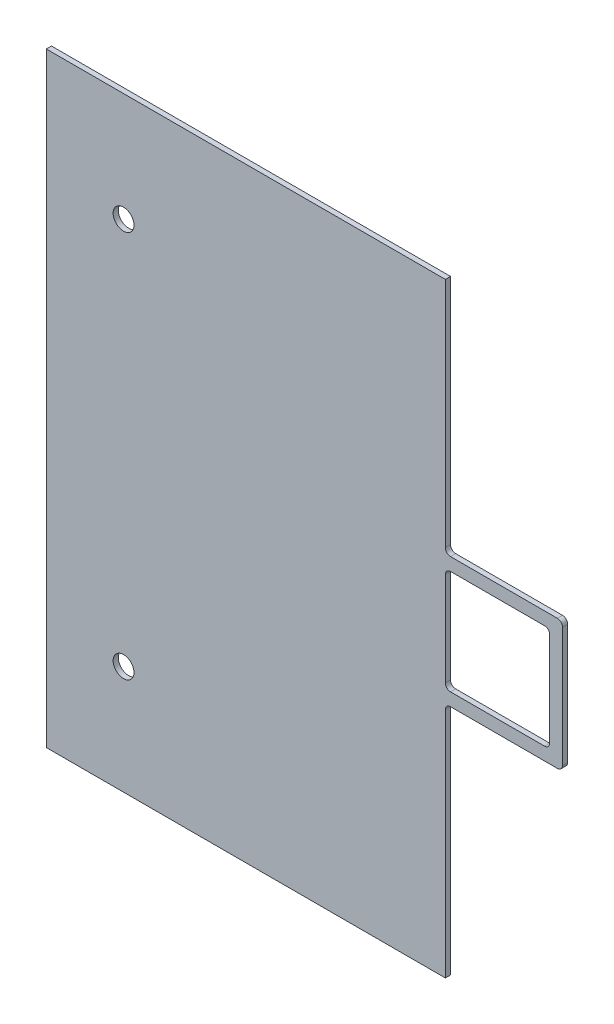
ISO-10303-21;
HEADER;
FILE_DESCRIPTION(('STEP AP214'),'2;1');
FILE_NAME('part.step','',(''),(''),'','','');
FILE_SCHEMA(('AUTOMOTIVE_DESIGN { 1 0 10303 214 1 1 1 1 }'));
ENDSEC;
DATA;
#1=APPLICATION_CONTEXT('core data for automotive mechanical design processes');
#2=APPLICATION_PROTOCOL_DEFINITION('international standard','automotive_design',2000,#1);
#3=PRODUCT_CONTEXT('',#1,'mechanical');
#4=PRODUCT('Part','Part','',(#3));
#5=PRODUCT_RELATED_PRODUCT_CATEGORY('part','',(#4));
#6=PRODUCT_DEFINITION_FORMATION('','',#4);
#7=PRODUCT_DEFINITION_CONTEXT('part definition',#1,'design');
#8=PRODUCT_DEFINITION('design','',#6,#7);
#9=PRODUCT_DEFINITION_SHAPE('','',#8);
#10=(LENGTH_UNIT() NAMED_UNIT(*) SI_UNIT(.MILLI.,.METRE.));
#11=(NAMED_UNIT(*) PLANE_ANGLE_UNIT() SI_UNIT($,.RADIAN.));
#12=(NAMED_UNIT(*) SI_UNIT($,.STERADIAN.) SOLID_ANGLE_UNIT());
#13=UNCERTAINTY_MEASURE_WITH_UNIT(LENGTH_MEASURE(1.E-05),#10,'distance_accuracy_value','');
#14=(GEOMETRIC_REPRESENTATION_CONTEXT(3) GLOBAL_UNCERTAINTY_ASSIGNED_CONTEXT((#13)) GLOBAL_UNIT_ASSIGNED_CONTEXT((#10,
#11,#12)) REPRESENTATION_CONTEXT('',''));
#15=CARTESIAN_POINT('',(0.,0.,0.));
#16=DIRECTION('',(0.,0.,1.));
#17=DIRECTION('',(1.,0.,0.));
#18=AXIS2_PLACEMENT_3D('',#15,#16,#17);
#19=CARTESIAN_POINT('',(155.,54.5,-4.));
#20=DIRECTION('',(1.,0.,0.));
#21=DIRECTION('',(0.,1.,0.));
#22=AXIS2_PLACEMENT_3D('',#19,#20,#21);
#23=PLANE('',#22);
#24=DIRECTION('',(0.,1.,0.));
#25=VECTOR('',#24,1.);
#26=CARTESIAN_POINT('',(155.,54.5,0.));
#27=LINE('',#26,#25);
#28=CARTESIAN_POINT('',(155.,54.5,0.));
#29=VERTEX_POINT('',#28);
#30=CARTESIAN_POINT('',(155.,235.,0.));
#31=VERTEX_POINT('',#30);
#32=EDGE_CURVE('E237',#29,#31,#27,.T.);
#33=ORIENTED_EDGE('',*,*,#32,.F.);
#34=DIRECTION('',(0.,0.,1.));
#35=VECTOR('',#34,1.);
#36=CARTESIAN_POINT('',(155.,54.5,-4.));
#37=LINE('',#36,#35);
#38=CARTESIAN_POINT('',(155.,54.5,-4.));
#39=VERTEX_POINT('',#38);
#40=EDGE_CURVE('E11',#39,#29,#37,.T.);
#41=ORIENTED_EDGE('',*,*,#40,.F.);
#42=DIRECTION('',(0.,1.,0.));
#43=VECTOR('',#42,1.);
#44=CARTESIAN_POINT('',(155.,54.5,-4.));
#45=LINE('',#44,#43);
#46=CARTESIAN_POINT('',(155.,235.,-4.));
#47=VERTEX_POINT('',#46);
#48=EDGE_CURVE('E249',#39,#47,#45,.T.);
#49=ORIENTED_EDGE('',*,*,#48,.T.);
#50=DIRECTION('',(0.,0.,1.));
#51=VECTOR('',#50,1.);
#52=CARTESIAN_POINT('',(155.,235.,-4.));
#53=LINE('',#52,#51);
#54=EDGE_CURVE('E42',#47,#31,#53,.T.);
#55=ORIENTED_EDGE('',*,*,#54,.T.);
#56=EDGE_LOOP('',(#33,#41,#49,#55));
#57=FACE_BOUND('',#56,.T.);
#58=ADVANCED_FACE('F39',(#57),#23,.T.);
#59=CARTESIAN_POINT('',(159.,54.5,-4.));
#60=DIRECTION('',(0.,0.,1.));
#61=DIRECTION('',(1.,0.,0.));
#62=AXIS2_PLACEMENT_3D('',#59,#60,#61);
#63=CYLINDRICAL_SURFACE('',#62,4.);
#64=CARTESIAN_POINT('',(159.,54.5,0.));
#65=DIRECTION('',(0.,0.,-1.));
#66=DIRECTION('',(-1.,0.,0.));
#67=AXIS2_PLACEMENT_3D('',#64,#65,#66);
#68=CIRCLE('',#67,4.);
#69=CARTESIAN_POINT('',(159.,50.5,0.));
#70=VERTEX_POINT('',#69);
#71=EDGE_CURVE('E253',#70,#29,#68,.T.);
#72=ORIENTED_EDGE('',*,*,#71,.F.);
#73=DIRECTION('',(0.,0.,1.));
#74=VECTOR('',#73,1.);
#75=CARTESIAN_POINT('',(159.,50.5,-4.));
#76=LINE('',#75,#74);
#77=CARTESIAN_POINT('',(159.,50.5,-4.));
#78=VERTEX_POINT('',#77);
#79=EDGE_CURVE('E47',#78,#70,#76,.T.);
#80=ORIENTED_EDGE('',*,*,#79,.F.);
#81=CARTESIAN_POINT('',(159.,54.5,-4.));
#82=DIRECTION('',(0.,0.,-1.));
#83=DIRECTION('',(-1.,0.,0.));
#84=AXIS2_PLACEMENT_3D('',#81,#82,#83);
#85=CIRCLE('',#84,4.);
#86=EDGE_CURVE('E283',#78,#39,#85,.T.);
#87=ORIENTED_EDGE('',*,*,#86,.T.);
#88=ORIENTED_EDGE('',*,*,#40,.T.);
#89=EDGE_LOOP('',(#72,#80,#87,#88));
#90=FACE_BOUND('',#89,.T.);
#91=ADVANCED_FACE('F350',(#90),#63,.F.);
#92=CARTESIAN_POINT('',(159.,50.5,-4.));
#93=DIRECTION('',(0.,1.,0.));
#94=DIRECTION('',(0.,0.,1.));
#95=AXIS2_PLACEMENT_3D('',#92,#93,#94);
#96=PLANE('',#95);
#97=DIRECTION('',(-1.,0.,0.));
#98=VECTOR('',#97,1.);
#99=CARTESIAN_POINT('',(159.,50.5,0.));
#100=LINE('',#99,#98);
#101=CARTESIAN_POINT('',(242.,50.5000000000001,0.));
#102=VERTEX_POINT('',#101);
#103=EDGE_CURVE('E315',#102,#70,#100,.T.);
#104=ORIENTED_EDGE('',*,*,#103,.F.);
#105=DIRECTION('',(0.,0.,1.));
#106=VECTOR('',#105,1.);
#107=CARTESIAN_POINT('',(242.,50.5000000000001,-4.));
#108=LINE('',#107,#106);
#109=CARTESIAN_POINT('',(242.,50.5000000000001,-4.));
#110=VERTEX_POINT('',#109);
#111=EDGE_CURVE('E321',#110,#102,#108,.T.);
#112=ORIENTED_EDGE('',*,*,#111,.F.);
#113=DIRECTION('',(-1.,0.,0.));
#114=VECTOR('',#113,1.);
#115=CARTESIAN_POINT('',(159.,50.5,-4.));
#116=LINE('',#115,#114);
#117=EDGE_CURVE('E280',#110,#78,#116,.T.);
#118=ORIENTED_EDGE('',*,*,#117,.T.);
#119=ORIENTED_EDGE('',*,*,#79,.T.);
#120=EDGE_LOOP('',(#104,#112,#118,#119));
#121=FACE_BOUND('',#120,.T.);
#122=ADVANCED_FACE('F385',(#121),#96,.T.);
#123=CARTESIAN_POINT('',(242.,46.5,-4.));
#124=DIRECTION('',(0.,0.,1.));
#125=DIRECTION('',(1.,0.,0.));
#126=AXIS2_PLACEMENT_3D('',#123,#124,#125);
#127=CYLINDRICAL_SURFACE('',#126,4.00000000000002);
#128=CARTESIAN_POINT('',(242.,46.5,0.));
#129=DIRECTION('',(0.,0.,1.));
#130=DIRECTION('',(-1.,0.,0.));
#131=AXIS2_PLACEMENT_3D('',#128,#129,#130);
#132=CIRCLE('',#131,4.00000000000002);
#133=CARTESIAN_POINT('',(246.,46.5,0.));
#134=VERTEX_POINT('',#133);
#135=EDGE_CURVE('E312',#134,#102,#132,.T.);
#136=ORIENTED_EDGE('',*,*,#135,.F.);
#137=DIRECTION('',(0.,0.,1.));
#138=VECTOR('',#137,1.);
#139=CARTESIAN_POINT('',(246.,46.5,-4.));
#140=LINE('',#139,#138);
#141=CARTESIAN_POINT('',(246.,46.5,-4.));
#142=VERTEX_POINT('',#141);
#143=EDGE_CURVE('E323',#142,#134,#140,.T.);
#144=ORIENTED_EDGE('',*,*,#143,.F.);
#145=CARTESIAN_POINT('',(242.,46.5,-4.));
#146=DIRECTION('',(0.,0.,1.));
#147=DIRECTION('',(-1.,0.,0.));
#148=AXIS2_PLACEMENT_3D('',#145,#146,#147);
#149=CIRCLE('',#148,4.00000000000002);
#150=EDGE_CURVE('E277',#142,#110,#149,.T.);
#151=ORIENTED_EDGE('',*,*,#150,.T.);
#152=ORIENTED_EDGE('',*,*,#111,.T.);
#153=EDGE_LOOP('',(#136,#144,#151,#152));
#154=FACE_BOUND('',#153,.T.);
#155=ADVANCED_FACE('F382',(#154),#127,.T.);
#156=CARTESIAN_POINT('',(246.,46.5,-4.));
#157=DIRECTION('',(1.,0.,0.));
#158=DIRECTION('',(0.,0.,-1.));
#159=AXIS2_PLACEMENT_3D('',#156,#157,#158);
#160=PLANE('',#159);
#161=DIRECTION('',(0.,1.,0.));
#162=VECTOR('',#161,1.);
#163=CARTESIAN_POINT('',(246.,46.5,0.));
#164=LINE('',#163,#162);
#165=CARTESIAN_POINT('',(246.,-46.5,0.));
#166=VERTEX_POINT('',#165);
#167=EDGE_CURVE('E309',#166,#134,#164,.T.);
#168=ORIENTED_EDGE('',*,*,#167,.F.);
#169=DIRECTION('',(0.,0.,1.));
#170=VECTOR('',#169,1.);
#171=CARTESIAN_POINT('',(246.,-46.5,-4.));
#172=LINE('',#171,#170);
#173=CARTESIAN_POINT('',(246.,-46.5,-4.));
#174=VERTEX_POINT('',#173);
#175=EDGE_CURVE('E325',#174,#166,#172,.T.);
#176=ORIENTED_EDGE('',*,*,#175,.F.);
#177=DIRECTION('',(0.,1.,0.));
#178=VECTOR('',#177,1.);
#179=CARTESIAN_POINT('',(246.,46.5,-4.));
#180=LINE('',#179,#178);
#181=EDGE_CURVE('E274',#174,#142,#180,.T.);
#182=ORIENTED_EDGE('',*,*,#181,.T.);
#183=ORIENTED_EDGE('',*,*,#143,.T.);
#184=EDGE_LOOP('',(#168,#176,#182,#183));
#185=FACE_BOUND('',#184,.T.);
#186=ADVANCED_FACE('F379',(#185),#160,.T.);
#187=CARTESIAN_POINT('',(242.,-46.5,-4.));
#188=DIRECTION('',(0.,0.,1.));
#189=DIRECTION('',(1.,0.,0.));
#190=AXIS2_PLACEMENT_3D('',#187,#188,#189);
#191=CYLINDRICAL_SURFACE('',#190,4.00000000000002);
#192=CARTESIAN_POINT('',(242.,-46.5,0.));
#193=DIRECTION('',(0.,0.,1.));
#194=DIRECTION('',(-1.,0.,0.));
#195=AXIS2_PLACEMENT_3D('',#192,#193,#194);
#196=CIRCLE('',#195,4.00000000000002);
#197=CARTESIAN_POINT('',(242.,-50.5,0.));
#198=VERTEX_POINT('',#197);
#199=EDGE_CURVE('E306',#198,#166,#196,.T.);
#200=ORIENTED_EDGE('',*,*,#199,.F.);
#201=DIRECTION('',(0.,0.,1.));
#202=VECTOR('',#201,1.);
#203=CARTESIAN_POINT('',(242.,-50.5,-4.));
#204=LINE('',#203,#202);
#205=CARTESIAN_POINT('',(242.,-50.5,-4.));
#206=VERTEX_POINT('',#205);
#207=EDGE_CURVE('E327',#206,#198,#204,.T.);
#208=ORIENTED_EDGE('',*,*,#207,.F.);
#209=CARTESIAN_POINT('',(242.,-46.5,-4.));
#210=DIRECTION('',(0.,0.,1.));
#211=DIRECTION('',(-1.,0.,0.));
#212=AXIS2_PLACEMENT_3D('',#209,#210,#211);
#213=CIRCLE('',#212,4.00000000000002);
#214=EDGE_CURVE('E271',#206,#174,#213,.T.);
#215=ORIENTED_EDGE('',*,*,#214,.T.);
#216=ORIENTED_EDGE('',*,*,#175,.T.);
#217=EDGE_LOOP('',(#200,#208,#215,#216));
#218=FACE_BOUND('',#217,.T.);
#219=ADVANCED_FACE('F375',(#218),#191,.T.);
#220=CARTESIAN_POINT('',(242.,-50.5,-4.));
#221=DIRECTION('',(0.,-1.,0.));
#222=DIRECTION('',(0.,0.,-1.));
#223=AXIS2_PLACEMENT_3D('',#220,#221,#222);
#224=PLANE('',#223);
#225=DIRECTION('',(1.,0.,0.));
#226=VECTOR('',#225,1.);
#227=CARTESIAN_POINT('',(242.,-50.5,0.));
#228=LINE('',#227,#226);
#229=CARTESIAN_POINT('',(159.,-50.5,0.));
#230=VERTEX_POINT('',#229);
#231=EDGE_CURVE('E303',#230,#198,#228,.T.);
#232=ORIENTED_EDGE('',*,*,#231,.F.);
#233=DIRECTION('',(0.,0.,1.));
#234=VECTOR('',#233,1.);
#235=CARTESIAN_POINT('',(159.,-50.5,-4.));
#236=LINE('',#235,#234);
#237=CARTESIAN_POINT('',(159.,-50.5,-4.));
#238=VERTEX_POINT('',#237);
#239=EDGE_CURVE('E329',#238,#230,#236,.T.);
#240=ORIENTED_EDGE('',*,*,#239,.F.);
#241=DIRECTION('',(1.,0.,0.));
#242=VECTOR('',#241,1.);
#243=CARTESIAN_POINT('',(242.,-50.5,-4.));
#244=LINE('',#243,#242);
#245=EDGE_CURVE('E268',#238,#206,#244,.T.);
#246=ORIENTED_EDGE('',*,*,#245,.T.);
#247=ORIENTED_EDGE('',*,*,#207,.T.);
#248=EDGE_LOOP('',(#232,#240,#246,#247));
#249=FACE_BOUND('',#248,.T.);
#250=ADVANCED_FACE('F371',(#249),#224,.T.);
#251=CARTESIAN_POINT('',(159.,-54.5,-4.));
#252=DIRECTION('',(0.,0.,1.));
#253=DIRECTION('',(1.,0.,0.));
#254=AXIS2_PLACEMENT_3D('',#251,#252,#253);
#255=CYLINDRICAL_SURFACE('',#254,4.);
#256=CARTESIAN_POINT('',(159.,-54.5,0.));
#257=DIRECTION('',(0.,0.,-1.));
#258=DIRECTION('',(1.,0.,0.));
#259=AXIS2_PLACEMENT_3D('',#256,#257,#258);
#260=CIRCLE('',#259,4.);
#261=CARTESIAN_POINT('',(155.,-54.5,0.));
#262=VERTEX_POINT('',#261);
#263=EDGE_CURVE('E300',#262,#230,#260,.T.);
#264=ORIENTED_EDGE('',*,*,#263,.F.);
#265=DIRECTION('',(0.,0.,1.));
#266=VECTOR('',#265,1.);
#267=CARTESIAN_POINT('',(155.,-54.5,-4.));
#268=LINE('',#267,#266);
#269=CARTESIAN_POINT('',(155.,-54.5,-4.));
#270=VERTEX_POINT('',#269);
#271=EDGE_CURVE('E331',#270,#262,#268,.T.);
#272=ORIENTED_EDGE('',*,*,#271,.F.);
#273=CARTESIAN_POINT('',(159.,-54.5,-4.));
#274=DIRECTION('',(0.,0.,-1.));
#275=DIRECTION('',(1.,0.,0.));
#276=AXIS2_PLACEMENT_3D('',#273,#274,#275);
#277=CIRCLE('',#276,4.);
#278=EDGE_CURVE('E265',#270,#238,#277,.T.);
#279=ORIENTED_EDGE('',*,*,#278,.T.);
#280=ORIENTED_EDGE('',*,*,#239,.T.);
#281=EDGE_LOOP('',(#264,#272,#279,#280));
#282=FACE_BOUND('',#281,.T.);
#283=ADVANCED_FACE('F367',(#282),#255,.F.);
#284=CARTESIAN_POINT('',(155.,-235.,-4.));
#285=DIRECTION('',(1.,0.,0.));
#286=DIRECTION('',(0.,1.,0.));
#287=AXIS2_PLACEMENT_3D('',#284,#285,#286);
#288=PLANE('',#287);
#289=DIRECTION('',(0.,1.,0.));
#290=VECTOR('',#289,1.);
#291=CARTESIAN_POINT('',(155.,-235.,0.));
#292=LINE('',#291,#290);
#293=CARTESIAN_POINT('',(155.,-235.,0.));
#294=VERTEX_POINT('',#293);
#295=EDGE_CURVE('E297',#294,#262,#292,.T.);
#296=ORIENTED_EDGE('',*,*,#295,.F.);
#297=DIRECTION('',(0.,0.,1.));
#298=VECTOR('',#297,1.);
#299=CARTESIAN_POINT('',(155.,-235.,-4.));
#300=LINE('',#299,#298);
#301=CARTESIAN_POINT('',(155.,-235.,-4.));
#302=VERTEX_POINT('',#301);
#303=EDGE_CURVE('E333',#302,#294,#300,.T.);
#304=ORIENTED_EDGE('',*,*,#303,.F.);
#305=DIRECTION('',(0.,1.,0.));
#306=VECTOR('',#305,1.);
#307=CARTESIAN_POINT('',(155.,-235.,-4.));
#308=LINE('',#307,#306);
#309=EDGE_CURVE('E262',#302,#270,#308,.T.);
#310=ORIENTED_EDGE('',*,*,#309,.T.);
#311=ORIENTED_EDGE('',*,*,#271,.T.);
#312=EDGE_LOOP('',(#296,#304,#310,#311));
#313=FACE_BOUND('',#312,.T.);
#314=ADVANCED_FACE('F363',(#313),#288,.T.);
#315=CARTESIAN_POINT('',(-155.,-235.,-4.));
#316=DIRECTION('',(0.,-1.,0.));
#317=DIRECTION('',(0.,0.,-1.));
#318=AXIS2_PLACEMENT_3D('',#315,#316,#317);
#319=PLANE('',#318);
#320=DIRECTION('',(1.,0.,0.));
#321=VECTOR('',#320,1.);
#322=CARTESIAN_POINT('',(-155.,-235.,0.));
#323=LINE('',#322,#321);
#324=CARTESIAN_POINT('',(-155.,-235.,0.));
#325=VERTEX_POINT('',#324);
#326=EDGE_CURVE('E294',#325,#294,#323,.T.);
#327=ORIENTED_EDGE('',*,*,#326,.F.);
#328=DIRECTION('',(0.,0.,1.));
#329=VECTOR('',#328,1.);
#330=CARTESIAN_POINT('',(-155.,-235.,-4.));
#331=LINE('',#330,#329);
#332=CARTESIAN_POINT('',(-155.,-235.,-4.));
#333=VERTEX_POINT('',#332);
#334=EDGE_CURVE('E335',#333,#325,#331,.T.);
#335=ORIENTED_EDGE('',*,*,#334,.F.);
#336=DIRECTION('',(1.,0.,0.));
#337=VECTOR('',#336,1.);
#338=CARTESIAN_POINT('',(-155.,-235.,-4.));
#339=LINE('',#338,#337);
#340=EDGE_CURVE('E259',#333,#302,#339,.T.);
#341=ORIENTED_EDGE('',*,*,#340,.T.);
#342=ORIENTED_EDGE('',*,*,#303,.T.);
#343=EDGE_LOOP('',(#327,#335,#341,#342));
#344=FACE_BOUND('',#343,.T.);
#345=ADVANCED_FACE('F361',(#344),#319,.T.);
#346=CARTESIAN_POINT('',(-155.,-235.,-4.));
#347=DIRECTION('',(-1.,0.,0.));
#348=DIRECTION('',(0.,0.,1.));
#349=AXIS2_PLACEMENT_3D('',#346,#347,#348);
#350=PLANE('',#349);
#351=DIRECTION('',(0.,-1.,0.));
#352=VECTOR('',#351,1.);
#353=CARTESIAN_POINT('',(-155.,-235.,0.));
#354=LINE('',#353,#352);
#355=CARTESIAN_POINT('',(-155.,235.,0.));
#356=VERTEX_POINT('',#355);
#357=EDGE_CURVE('E291',#356,#325,#354,.T.);
#358=ORIENTED_EDGE('',*,*,#357,.F.);
#359=DIRECTION('',(0.,0.,1.));
#360=VECTOR('',#359,1.);
#361=CARTESIAN_POINT('',(-155.,235.,-4.));
#362=LINE('',#361,#360);
#363=CARTESIAN_POINT('',(-155.,235.,-4.));
#364=VERTEX_POINT('',#363);
#365=EDGE_CURVE('E336',#364,#356,#362,.T.);
#366=ORIENTED_EDGE('',*,*,#365,.F.);
#367=DIRECTION('',(0.,-1.,0.));
#368=VECTOR('',#367,1.);
#369=CARTESIAN_POINT('',(-155.,-235.,-4.));
#370=LINE('',#369,#368);
#371=EDGE_CURVE('E256',#364,#333,#370,.T.);
#372=ORIENTED_EDGE('',*,*,#371,.T.);
#373=ORIENTED_EDGE('',*,*,#334,.T.);
#374=EDGE_LOOP('',(#358,#366,#372,#373));
#375=FACE_BOUND('',#374,.T.);
#376=ADVANCED_FACE('F357',(#375),#350,.T.);
#377=CARTESIAN_POINT('',(-155.,235.,-4.));
#378=DIRECTION('',(0.,1.,0.));
#379=DIRECTION('',(0.,0.,1.));
#380=AXIS2_PLACEMENT_3D('',#377,#378,#379);
#381=PLANE('',#380);
#382=DIRECTION('',(-1.,0.,0.));
#383=VECTOR('',#382,1.);
#384=CARTESIAN_POINT('',(-155.,235.,0.));
#385=LINE('',#384,#383);
#386=EDGE_CURVE('E288',#31,#356,#385,.T.);
#387=ORIENTED_EDGE('',*,*,#386,.F.);
#388=ORIENTED_EDGE('',*,*,#54,.F.);
#389=DIRECTION('',(-1.,0.,0.));
#390=VECTOR('',#389,1.);
#391=CARTESIAN_POINT('',(-155.,235.,-4.));
#392=LINE('',#391,#390);
#393=EDGE_CURVE('E252',#47,#364,#392,.T.);
#394=ORIENTED_EDGE('',*,*,#393,.T.);
#395=ORIENTED_EDGE('',*,*,#365,.T.);
#396=EDGE_LOOP('',(#387,#388,#394,#395));
#397=FACE_BOUND('',#396,.T.);
#398=ADVANCED_FACE('F344',(#397),#381,.T.);
#399=CARTESIAN_POINT('',(159.,-54.5,-4.));
#400=DIRECTION('',(0.,0.,1.));
#401=DIRECTION('',(1.,0.,0.));
#402=AXIS2_PLACEMENT_3D('',#399,#400,#401);
#403=PLANE('',#402);
#404=CARTESIAN_POINT('',(-95.,-150.5,-4.));
#405=DIRECTION('',(0.,0.,1.));
#406=DIRECTION('',(1.,0.,0.));
#407=AXIS2_PLACEMENT_3D('',#404,#405,#406);
#408=CIRCLE('',#407,8.09999999999999);
#409=CARTESIAN_POINT('',(-86.9,-150.5,-4.));
#410=VERTEX_POINT('',#409);
#411=EDGE_CURVE('E644',#410,#410,#408,.T.);
#412=ORIENTED_EDGE('',*,*,#411,.T.);
#413=EDGE_LOOP('',(#412));
#414=FACE_BOUND('',#413,.T.);
#415=CARTESIAN_POINT('',(-95.0000000000001,150.5,-4.));
#416=DIRECTION('',(0.,0.,1.));
#417=DIRECTION('',(1.,0.,0.));
#418=AXIS2_PLACEMENT_3D('',#415,#416,#417);
#419=CIRCLE('',#418,8.09999999999999);
#420=CARTESIAN_POINT('',(-86.9000000000001,150.5,-4.));
#421=VERTEX_POINT('',#420);
#422=EDGE_CURVE('E219',#421,#421,#419,.T.);
#423=ORIENTED_EDGE('',*,*,#422,.T.);
#424=EDGE_LOOP('',(#423));
#425=FACE_BOUND('',#424,.T.);
#426=DIRECTION('',(0.,-1.,0.));
#427=VECTOR('',#426,1.);
#428=CARTESIAN_POINT('',(155.,-36.5,-4.));
#429=LINE('',#428,#427);
#430=CARTESIAN_POINT('',(155.,36.5,-4.));
#431=VERTEX_POINT('',#430);
#432=CARTESIAN_POINT('',(155.,-36.5,-4.));
#433=VERTEX_POINT('',#432);
#434=EDGE_CURVE('E184',#431,#433,#429,.T.);
#435=ORIENTED_EDGE('',*,*,#434,.T.);
#436=CARTESIAN_POINT('',(159.,-36.5,-4.));
#437=DIRECTION('',(0.,0.,1.));
#438=DIRECTION('',(-1.,0.,0.));
#439=AXIS2_PLACEMENT_3D('',#436,#437,#438);
#440=CIRCLE('',#439,4.);
#441=CARTESIAN_POINT('',(159.,-40.5,-4.));
#442=VERTEX_POINT('',#441);
#443=EDGE_CURVE('E178',#433,#442,#440,.T.);
#444=ORIENTED_EDGE('',*,*,#443,.T.);
#445=DIRECTION('',(1.,0.,0.));
#446=VECTOR('',#445,1.);
#447=CARTESIAN_POINT('',(232.,-40.5,-4.));
#448=LINE('',#447,#446);
#449=CARTESIAN_POINT('',(232.,-40.5,-4.));
#450=VERTEX_POINT('',#449);
#451=EDGE_CURVE('E187',#442,#450,#448,.T.);
#452=ORIENTED_EDGE('',*,*,#451,.T.);
#453=CARTESIAN_POINT('',(232.,-36.5,-4.));
#454=DIRECTION('',(0.,0.,1.));
#455=DIRECTION('',(-1.,0.,0.));
#456=AXIS2_PLACEMENT_3D('',#453,#454,#455);
#457=CIRCLE('',#456,3.99999999999998);
#458=CARTESIAN_POINT('',(236.,-36.5,-4.));
#459=VERTEX_POINT('',#458);
#460=EDGE_CURVE('E55',#450,#459,#457,.T.);
#461=ORIENTED_EDGE('',*,*,#460,.T.);
#462=DIRECTION('',(0.,1.,0.));
#463=VECTOR('',#462,1.);
#464=CARTESIAN_POINT('',(236.,36.5,-4.));
#465=LINE('',#464,#463);
#466=CARTESIAN_POINT('',(236.,36.5,-4.));
#467=VERTEX_POINT('',#466);
#468=EDGE_CURVE('E205',#459,#467,#465,.T.);
#469=ORIENTED_EDGE('',*,*,#468,.T.);
#470=CARTESIAN_POINT('',(232.,36.5,-4.));
#471=DIRECTION('',(0.,0.,1.));
#472=DIRECTION('',(-1.,0.,0.));
#473=AXIS2_PLACEMENT_3D('',#470,#471,#472);
#474=CIRCLE('',#473,3.99999999999999);
#475=CARTESIAN_POINT('',(232.,40.5,-4.));
#476=VERTEX_POINT('',#475);
#477=EDGE_CURVE('E208',#467,#476,#474,.T.);
#478=ORIENTED_EDGE('',*,*,#477,.T.);
#479=DIRECTION('',(-1.,0.,0.));
#480=VECTOR('',#479,1.);
#481=CARTESIAN_POINT('',(159.,40.5,-4.));
#482=LINE('',#481,#480);
#483=CARTESIAN_POINT('',(159.,40.5,-4.));
#484=VERTEX_POINT('',#483);
#485=EDGE_CURVE('E211',#476,#484,#482,.T.);
#486=ORIENTED_EDGE('',*,*,#485,.T.);
#487=CARTESIAN_POINT('',(159.,36.5,-4.));
#488=DIRECTION('',(0.,0.,1.));
#489=DIRECTION('',(1.,0.,0.));
#490=AXIS2_PLACEMENT_3D('',#487,#488,#489);
#491=CIRCLE('',#490,4.);
#492=EDGE_CURVE('E214',#484,#431,#491,.T.);
#493=ORIENTED_EDGE('',*,*,#492,.T.);
#494=EDGE_LOOP('',(#435,#444,#452,#461,#469,#478,#486,#493));
#495=FACE_BOUND('',#494,.T.);
#496=ORIENTED_EDGE('',*,*,#48,.F.);
#497=ORIENTED_EDGE('',*,*,#86,.F.);
#498=ORIENTED_EDGE('',*,*,#117,.F.);
#499=ORIENTED_EDGE('',*,*,#150,.F.);
#500=ORIENTED_EDGE('',*,*,#181,.F.);
#501=ORIENTED_EDGE('',*,*,#214,.F.);
#502=ORIENTED_EDGE('',*,*,#245,.F.);
#503=ORIENTED_EDGE('',*,*,#278,.F.);
#504=ORIENTED_EDGE('',*,*,#309,.F.);
#505=ORIENTED_EDGE('',*,*,#340,.F.);
#506=ORIENTED_EDGE('',*,*,#371,.F.);
#507=ORIENTED_EDGE('',*,*,#393,.F.);
#508=EDGE_LOOP('',(#496,#497,#498,#499,#500,#501,#502,#503,#504,#505,#506,#507));
#509=FACE_BOUND('',#508,.T.);
#510=ADVANCED_FACE('F191',(#414,#425,#495,#509),#403,.F.);
#511=CARTESIAN_POINT('',(159.,-54.5,0.));
#512=DIRECTION('',(0.,0.,1.));
#513=DIRECTION('',(1.,0.,0.));
#514=AXIS2_PLACEMENT_3D('',#511,#512,#513);
#515=PLANE('',#514);
#516=CARTESIAN_POINT('',(-95.,-150.5,0.));
#517=DIRECTION('',(0.,0.,1.));
#518=DIRECTION('',(1.,0.,0.));
#519=AXIS2_PLACEMENT_3D('',#516,#517,#518);
#520=CIRCLE('',#519,8.09999999999999);
#521=CARTESIAN_POINT('',(-86.9,-150.5,0.));
#522=VERTEX_POINT('',#521);
#523=EDGE_CURVE('E647',#522,#522,#520,.T.);
#524=ORIENTED_EDGE('',*,*,#523,.F.);
#525=EDGE_LOOP('',(#524));
#526=FACE_BOUND('',#525,.T.);
#527=CARTESIAN_POINT('',(-95.0000000000001,150.5,0.));
#528=DIRECTION('',(0.,0.,1.));
#529=DIRECTION('',(1.,0.,0.));
#530=AXIS2_PLACEMENT_3D('',#527,#528,#529);
#531=CIRCLE('',#530,8.09999999999999);
#532=CARTESIAN_POINT('',(-86.9000000000001,150.5,0.));
#533=VERTEX_POINT('',#532);
#534=EDGE_CURVE('E201',#533,#533,#531,.T.);
#535=ORIENTED_EDGE('',*,*,#534,.F.);
#536=EDGE_LOOP('',(#535));
#537=FACE_BOUND('',#536,.T.);
#538=CARTESIAN_POINT('',(159.,-36.5,0.));
#539=DIRECTION('',(0.,0.,1.));
#540=DIRECTION('',(-1.,0.,0.));
#541=AXIS2_PLACEMENT_3D('',#538,#539,#540);
#542=CIRCLE('',#541,4.);
#543=CARTESIAN_POINT('',(155.,-36.5,0.));
#544=VERTEX_POINT('',#543);
#545=CARTESIAN_POINT('',(159.,-40.5,0.));
#546=VERTEX_POINT('',#545);
#547=EDGE_CURVE('E63',#544,#546,#542,.T.);
#548=ORIENTED_EDGE('',*,*,#547,.F.);
#549=DIRECTION('',(0.,-1.,0.));
#550=VECTOR('',#549,1.);
#551=CARTESIAN_POINT('',(155.,-36.5,0.));
#552=LINE('',#551,#550);
#553=CARTESIAN_POINT('',(155.,36.5,0.));
#554=VERTEX_POINT('',#553);
#555=EDGE_CURVE('E195',#554,#544,#552,.T.);
#556=ORIENTED_EDGE('',*,*,#555,.F.);
#557=CARTESIAN_POINT('',(159.,36.5,0.));
#558=DIRECTION('',(0.,0.,1.));
#559=DIRECTION('',(1.,0.,0.));
#560=AXIS2_PLACEMENT_3D('',#557,#558,#559);
#561=CIRCLE('',#560,4.);
#562=CARTESIAN_POINT('',(159.,40.5,0.));
#563=VERTEX_POINT('',#562);
#564=EDGE_CURVE('E198',#563,#554,#561,.T.);
#565=ORIENTED_EDGE('',*,*,#564,.F.);
#566=DIRECTION('',(-1.,0.,0.));
#567=VECTOR('',#566,1.);
#568=CARTESIAN_POINT('',(159.,40.5,0.));
#569=LINE('',#568,#567);
#570=CARTESIAN_POINT('',(232.,40.5,0.));
#571=VERTEX_POINT('',#570);
#572=EDGE_CURVE('E230',#571,#563,#569,.T.);
#573=ORIENTED_EDGE('',*,*,#572,.F.);
#574=CARTESIAN_POINT('',(232.,36.5,0.));
#575=DIRECTION('',(0.,0.,1.));
#576=DIRECTION('',(-1.,0.,0.));
#577=AXIS2_PLACEMENT_3D('',#574,#575,#576);
#578=CIRCLE('',#577,3.99999999999999);
#579=CARTESIAN_POINT('',(236.,36.5,0.));
#580=VERTEX_POINT('',#579);
#581=EDGE_CURVE('E227',#580,#571,#578,.T.);
#582=ORIENTED_EDGE('',*,*,#581,.F.);
#583=DIRECTION('',(0.,1.,0.));
#584=VECTOR('',#583,1.);
#585=CARTESIAN_POINT('',(236.,36.5,0.));
#586=LINE('',#585,#584);
#587=CARTESIAN_POINT('',(236.,-36.5,0.));
#588=VERTEX_POINT('',#587);
#589=EDGE_CURVE('E224',#588,#580,#586,.T.);
#590=ORIENTED_EDGE('',*,*,#589,.F.);
#591=CARTESIAN_POINT('',(232.,-36.5,0.));
#592=DIRECTION('',(0.,0.,1.));
#593=DIRECTION('',(-1.,0.,0.));
#594=AXIS2_PLACEMENT_3D('',#591,#592,#593);
#595=CIRCLE('',#594,3.99999999999998);
#596=CARTESIAN_POINT('',(232.,-40.5,0.));
#597=VERTEX_POINT('',#596);
#598=EDGE_CURVE('E221',#597,#588,#595,.T.);
#599=ORIENTED_EDGE('',*,*,#598,.F.);
#600=DIRECTION('',(1.,0.,0.));
#601=VECTOR('',#600,1.);
#602=CARTESIAN_POINT('',(232.,-40.5,0.));
#603=LINE('',#602,#601);
#604=EDGE_CURVE('E218',#546,#597,#603,.T.);
#605=ORIENTED_EDGE('',*,*,#604,.F.);
#606=EDGE_LOOP('',(#548,#556,#565,#573,#582,#590,#599,#605));
#607=FACE_BOUND('',#606,.T.);
#608=ORIENTED_EDGE('',*,*,#32,.T.);
#609=ORIENTED_EDGE('',*,*,#386,.T.);
#610=ORIENTED_EDGE('',*,*,#357,.T.);
#611=ORIENTED_EDGE('',*,*,#326,.T.);
#612=ORIENTED_EDGE('',*,*,#295,.T.);
#613=ORIENTED_EDGE('',*,*,#263,.T.);
#614=ORIENTED_EDGE('',*,*,#231,.T.);
#615=ORIENTED_EDGE('',*,*,#199,.T.);
#616=ORIENTED_EDGE('',*,*,#167,.T.);
#617=ORIENTED_EDGE('',*,*,#135,.T.);
#618=ORIENTED_EDGE('',*,*,#103,.T.);
#619=ORIENTED_EDGE('',*,*,#71,.T.);
#620=EDGE_LOOP('',(#608,#609,#610,#611,#612,#613,#614,#615,#616,#617,#618,#619));
#621=FACE_BOUND('',#620,.T.);
#622=ADVANCED_FACE('F346',(#526,#537,#607,#621),#515,.T.);
#623=CARTESIAN_POINT('',(159.,-36.5,-4.));
#624=DIRECTION('',(0.,0.,1.));
#625=DIRECTION('',(1.,0.,0.));
#626=AXIS2_PLACEMENT_3D('',#623,#624,#625);
#627=CYLINDRICAL_SURFACE('',#626,4.);
#628=ORIENTED_EDGE('',*,*,#547,.T.);
#629=DIRECTION('',(0.,0.,1.));
#630=VECTOR('',#629,1.);
#631=CARTESIAN_POINT('',(159.,-40.5,-4.));
#632=LINE('',#631,#630);
#633=EDGE_CURVE('E174',#442,#546,#632,.T.);
#634=ORIENTED_EDGE('',*,*,#633,.F.);
#635=ORIENTED_EDGE('',*,*,#443,.F.);
#636=DIRECTION('',(0.,0.,1.));
#637=VECTOR('',#636,1.);
#638=CARTESIAN_POINT('',(155.,-36.5,-4.));
#639=LINE('',#638,#637);
#640=EDGE_CURVE('E235',#433,#544,#639,.T.);
#641=ORIENTED_EDGE('',*,*,#640,.T.);
#642=EDGE_LOOP('',(#628,#634,#635,#641));
#643=FACE_BOUND('',#642,.T.);
#644=ADVANCED_FACE('F176',(#643),#627,.F.);
#645=CARTESIAN_POINT('',(155.,-36.5,-4.));
#646=DIRECTION('',(-1.,0.,0.));
#647=DIRECTION('',(0.,0.,1.));
#648=AXIS2_PLACEMENT_3D('',#645,#646,#647);
#649=PLANE('',#648);
#650=ORIENTED_EDGE('',*,*,#555,.T.);
#651=ORIENTED_EDGE('',*,*,#640,.F.);
#652=ORIENTED_EDGE('',*,*,#434,.F.);
#653=DIRECTION('',(0.,0.,1.));
#654=VECTOR('',#653,1.);
#655=CARTESIAN_POINT('',(155.,36.5,-4.));
#656=LINE('',#655,#654);
#657=EDGE_CURVE('E238',#431,#554,#656,.T.);
#658=ORIENTED_EDGE('',*,*,#657,.T.);
#659=EDGE_LOOP('',(#650,#651,#652,#658));
#660=FACE_BOUND('',#659,.T.);
#661=ADVANCED_FACE('F514',(#660),#649,.F.);
#662=CARTESIAN_POINT('',(159.,36.5,-4.));
#663=DIRECTION('',(0.,0.,1.));
#664=DIRECTION('',(1.,0.,0.));
#665=AXIS2_PLACEMENT_3D('',#662,#663,#664);
#666=CYLINDRICAL_SURFACE('',#665,4.);
#667=ORIENTED_EDGE('',*,*,#564,.T.);
#668=ORIENTED_EDGE('',*,*,#657,.F.);
#669=ORIENTED_EDGE('',*,*,#492,.F.);
#670=DIRECTION('',(0.,0.,1.));
#671=VECTOR('',#670,1.);
#672=CARTESIAN_POINT('',(159.,40.5,-4.));
#673=LINE('',#672,#671);
#674=EDGE_CURVE('E240',#484,#563,#673,.T.);
#675=ORIENTED_EDGE('',*,*,#674,.T.);
#676=EDGE_LOOP('',(#667,#668,#669,#675));
#677=FACE_BOUND('',#676,.T.);
#678=ADVANCED_FACE('F524',(#677),#666,.F.);
#679=CARTESIAN_POINT('',(159.,40.5,-4.));
#680=DIRECTION('',(0.,1.,0.));
#681=DIRECTION('',(-1.,0.,0.));
#682=AXIS2_PLACEMENT_3D('',#679,#680,#681);
#683=PLANE('',#682);
#684=ORIENTED_EDGE('',*,*,#572,.T.);
#685=ORIENTED_EDGE('',*,*,#674,.F.);
#686=ORIENTED_EDGE('',*,*,#485,.F.);
#687=DIRECTION('',(0.,0.,1.));
#688=VECTOR('',#687,1.);
#689=CARTESIAN_POINT('',(232.,40.5,-4.));
#690=LINE('',#689,#688);
#691=EDGE_CURVE('E242',#476,#571,#690,.T.);
#692=ORIENTED_EDGE('',*,*,#691,.T.);
#693=EDGE_LOOP('',(#684,#685,#686,#692));
#694=FACE_BOUND('',#693,.T.);
#695=ADVANCED_FACE('F535',(#694),#683,.F.);
#696=CARTESIAN_POINT('',(232.,36.5,-4.));
#697=DIRECTION('',(0.,0.,1.));
#698=DIRECTION('',(1.,0.,0.));
#699=AXIS2_PLACEMENT_3D('',#696,#697,#698);
#700=CYLINDRICAL_SURFACE('',#699,3.99999999999999);
#701=ORIENTED_EDGE('',*,*,#581,.T.);
#702=ORIENTED_EDGE('',*,*,#691,.F.);
#703=ORIENTED_EDGE('',*,*,#477,.F.);
#704=DIRECTION('',(0.,0.,1.));
#705=VECTOR('',#704,1.);
#706=CARTESIAN_POINT('',(236.,36.5,-4.));
#707=LINE('',#706,#705);
#708=EDGE_CURVE('E244',#467,#580,#707,.T.);
#709=ORIENTED_EDGE('',*,*,#708,.T.);
#710=EDGE_LOOP('',(#701,#702,#703,#709));
#711=FACE_BOUND('',#710,.T.);
#712=ADVANCED_FACE('F546',(#711),#700,.F.);
#713=CARTESIAN_POINT('',(236.,36.5,-4.));
#714=DIRECTION('',(1.,0.,0.));
#715=DIRECTION('',(0.,0.,-1.));
#716=AXIS2_PLACEMENT_3D('',#713,#714,#715);
#717=PLANE('',#716);
#718=ORIENTED_EDGE('',*,*,#589,.T.);
#719=ORIENTED_EDGE('',*,*,#708,.F.);
#720=ORIENTED_EDGE('',*,*,#468,.F.);
#721=DIRECTION('',(0.,0.,1.));
#722=VECTOR('',#721,1.);
#723=CARTESIAN_POINT('',(236.,-36.5,-4.));
#724=LINE('',#723,#722);
#725=EDGE_CURVE('E246',#459,#588,#724,.T.);
#726=ORIENTED_EDGE('',*,*,#725,.T.);
#727=EDGE_LOOP('',(#718,#719,#720,#726));
#728=FACE_BOUND('',#727,.T.);
#729=ADVANCED_FACE('F557',(#728),#717,.F.);
#730=CARTESIAN_POINT('',(232.,-36.5,-4.));
#731=DIRECTION('',(0.,0.,1.));
#732=DIRECTION('',(1.,0.,0.));
#733=AXIS2_PLACEMENT_3D('',#730,#731,#732);
#734=CYLINDRICAL_SURFACE('',#733,3.99999999999998);
#735=ORIENTED_EDGE('',*,*,#598,.T.);
#736=ORIENTED_EDGE('',*,*,#725,.F.);
#737=ORIENTED_EDGE('',*,*,#460,.F.);
#738=DIRECTION('',(0.,0.,1.));
#739=VECTOR('',#738,1.);
#740=CARTESIAN_POINT('',(232.,-40.5,-4.));
#741=LINE('',#740,#739);
#742=EDGE_CURVE('E183',#450,#597,#741,.T.);
#743=ORIENTED_EDGE('',*,*,#742,.T.);
#744=EDGE_LOOP('',(#735,#736,#737,#743));
#745=FACE_BOUND('',#744,.T.);
#746=ADVANCED_FACE('F568',(#745),#734,.F.);
#747=CARTESIAN_POINT('',(232.,-40.5,-4.));
#748=DIRECTION('',(0.,-1.,0.));
#749=DIRECTION('',(1.,0.,0.));
#750=AXIS2_PLACEMENT_3D('',#747,#748,#749);
#751=PLANE('',#750);
#752=ORIENTED_EDGE('',*,*,#604,.T.);
#753=ORIENTED_EDGE('',*,*,#742,.F.);
#754=ORIENTED_EDGE('',*,*,#451,.F.);
#755=ORIENTED_EDGE('',*,*,#633,.T.);
#756=EDGE_LOOP('',(#752,#753,#754,#755));
#757=FACE_BOUND('',#756,.T.);
#758=ADVANCED_FACE('F188',(#757),#751,.F.);
#759=CARTESIAN_POINT('',(-95.0000000000001,150.5,-4.));
#760=DIRECTION('',(0.,0.,1.));
#761=DIRECTION('',(1.,0.,0.));
#762=AXIS2_PLACEMENT_3D('',#759,#760,#761);
#763=CYLINDRICAL_SURFACE('',#762,8.09999999999999);
#764=ORIENTED_EDGE('',*,*,#422,.F.);
#765=EDGE_LOOP('',(#764));
#766=FACE_BOUND('',#765,.T.);
#767=ORIENTED_EDGE('',*,*,#534,.T.);
#768=EDGE_LOOP('',(#767));
#769=FACE_BOUND('',#768,.T.);
#770=ADVANCED_FACE('F588',(#766,#769),#763,.F.);
#771=CARTESIAN_POINT('',(-95.,-150.5,-4.));
#772=DIRECTION('',(0.,0.,1.));
#773=DIRECTION('',(1.,0.,0.));
#774=AXIS2_PLACEMENT_3D('',#771,#772,#773);
#775=CYLINDRICAL_SURFACE('',#774,8.09999999999999);
#776=ORIENTED_EDGE('',*,*,#411,.F.);
#777=EDGE_LOOP('',(#776));
#778=FACE_BOUND('',#777,.T.);
#779=ORIENTED_EDGE('',*,*,#523,.T.);
#780=EDGE_LOOP('',(#779));
#781=FACE_BOUND('',#780,.T.);
#782=ADVANCED_FACE('F598',(#778,#781),#775,.F.);
#783=CLOSED_SHELL('',(#58,#91,#122,#155,#186,#219,#250,#283,#314,#345,#376,#398,#510,#622,#644,
#661,#678,#695,#712,#729,#746,#758,#770,#782));
#784=MANIFOLD_SOLID_BREP('B2',#783);
#785=ADVANCED_BREP_SHAPE_REPRESENTATION('',(#18,#784),#14);
#786=SHAPE_DEFINITION_REPRESENTATION(#9,#785);
ENDSEC;
END-ISO-10303-21;
